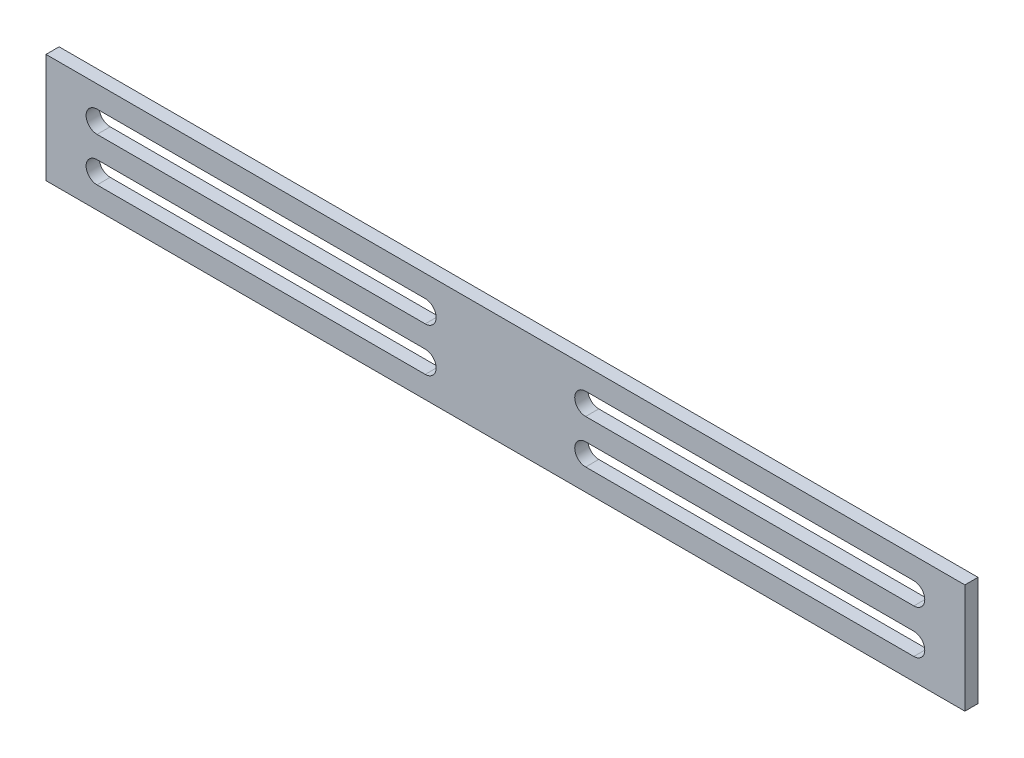
ISO-10303-21;
HEADER;
FILE_DESCRIPTION(('STEP AP214'),'2;1');
FILE_NAME('part.step','',(''),(''),'','','');
FILE_SCHEMA(('AUTOMOTIVE_DESIGN { 1 0 10303 214 1 1 1 1 }'));
ENDSEC;
DATA;
#1=APPLICATION_CONTEXT('core data for automotive mechanical design processes');
#2=APPLICATION_PROTOCOL_DEFINITION('international standard','automotive_design',2000,#1);
#3=PRODUCT_CONTEXT('',#1,'mechanical');
#4=PRODUCT('Part','Part','',(#3));
#5=PRODUCT_RELATED_PRODUCT_CATEGORY('part','',(#4));
#6=PRODUCT_DEFINITION_FORMATION('','',#4);
#7=PRODUCT_DEFINITION_CONTEXT('part definition',#1,'design');
#8=PRODUCT_DEFINITION('design','',#6,#7);
#9=PRODUCT_DEFINITION_SHAPE('','',#8);
#10=(LENGTH_UNIT() NAMED_UNIT(*) SI_UNIT(.MILLI.,.METRE.));
#11=(NAMED_UNIT(*) PLANE_ANGLE_UNIT() SI_UNIT($,.RADIAN.));
#12=(NAMED_UNIT(*) SI_UNIT($,.STERADIAN.) SOLID_ANGLE_UNIT());
#13=UNCERTAINTY_MEASURE_WITH_UNIT(LENGTH_MEASURE(1.E-05),#10,'distance_accuracy_value','');
#14=(GEOMETRIC_REPRESENTATION_CONTEXT(3) GLOBAL_UNCERTAINTY_ASSIGNED_CONTEXT((#13)) GLOBAL_UNIT_ASSIGNED_CONTEXT((#10,
#11,#12)) REPRESENTATION_CONTEXT('',''));
#15=CARTESIAN_POINT('',(0.,0.,0.));
#16=DIRECTION('',(0.,0.,1.));
#17=DIRECTION('',(1.,0.,0.));
#18=AXIS2_PLACEMENT_3D('',#15,#16,#17);
#19=CARTESIAN_POINT('',(63.,-7.5,1.8));
#20=DIRECTION('',(-1.,0.,0.));
#21=DIRECTION('',(0.,0.,1.));
#22=AXIS2_PLACEMENT_3D('',#19,#20,#21);
#23=PLANE('',#22);
#24=DIRECTION('',(0.,1.,0.));
#25=VECTOR('',#24,1.);
#26=CARTESIAN_POINT('',(63.,-7.5,0.));
#27=LINE('',#26,#25);
#28=CARTESIAN_POINT('',(63.,-7.5,0.));
#29=VERTEX_POINT('',#28);
#30=CARTESIAN_POINT('',(63.,7.5,0.));
#31=VERTEX_POINT('',#30);
#32=EDGE_CURVE('E297',#29,#31,#27,.T.);
#33=ORIENTED_EDGE('',*,*,#32,.T.);
#34=DIRECTION('',(0.,0.,-1.));
#35=VECTOR('',#34,1.);
#36=CARTESIAN_POINT('',(63.,7.5,1.8));
#37=LINE('',#36,#35);
#38=CARTESIAN_POINT('',(63.,7.5,1.8));
#39=VERTEX_POINT('',#38);
#40=EDGE_CURVE('E11',#39,#31,#37,.T.);
#41=ORIENTED_EDGE('',*,*,#40,.F.);
#42=DIRECTION('',(0.,1.,0.));
#43=VECTOR('',#42,1.);
#44=CARTESIAN_POINT('',(63.,-7.5,1.8));
#45=LINE('',#44,#43);
#46=CARTESIAN_POINT('',(63.,-7.5,1.8));
#47=VERTEX_POINT('',#46);
#48=EDGE_CURVE('E307',#47,#39,#45,.T.);
#49=ORIENTED_EDGE('',*,*,#48,.F.);
#50=DIRECTION('',(0.,0.,-1.));
#51=VECTOR('',#50,1.);
#52=CARTESIAN_POINT('',(63.,-7.5,1.8));
#53=LINE('',#52,#51);
#54=EDGE_CURVE('E320',#47,#29,#53,.T.);
#55=ORIENTED_EDGE('',*,*,#54,.T.);
#56=EDGE_LOOP('',(#33,#41,#49,#55));
#57=FACE_BOUND('',#56,.T.);
#58=ADVANCED_FACE('F39',(#57),#23,.F.);
#59=CARTESIAN_POINT('',(-63.,7.5,1.8));
#60=DIRECTION('',(0.,-1.,0.));
#61=DIRECTION('',(0.,0.,-1.));
#62=AXIS2_PLACEMENT_3D('',#59,#60,#61);
#63=PLANE('',#62);
#64=DIRECTION('',(-1.,0.,0.));
#65=VECTOR('',#64,1.);
#66=CARTESIAN_POINT('',(-63.,7.5,0.));
#67=LINE('',#66,#65);
#68=CARTESIAN_POINT('',(-63.,7.5,0.));
#69=VERTEX_POINT('',#68);
#70=EDGE_CURVE('E319',#31,#69,#67,.T.);
#71=ORIENTED_EDGE('',*,*,#70,.T.);
#72=DIRECTION('',(0.,0.,-1.));
#73=VECTOR('',#72,1.);
#74=CARTESIAN_POINT('',(-63.,7.5,1.8));
#75=LINE('',#74,#73);
#76=CARTESIAN_POINT('',(-63.,7.5,1.8));
#77=VERTEX_POINT('',#76);
#78=EDGE_CURVE('E46',#77,#69,#75,.T.);
#79=ORIENTED_EDGE('',*,*,#78,.F.);
#80=DIRECTION('',(-1.,0.,0.));
#81=VECTOR('',#80,1.);
#82=CARTESIAN_POINT('',(-63.,7.5,1.8));
#83=LINE('',#82,#81);
#84=EDGE_CURVE('E309',#39,#77,#83,.T.);
#85=ORIENTED_EDGE('',*,*,#84,.F.);
#86=ORIENTED_EDGE('',*,*,#40,.T.);
#87=EDGE_LOOP('',(#71,#79,#85,#86));
#88=FACE_BOUND('',#87,.T.);
#89=ADVANCED_FACE('F349',(#88),#63,.F.);
#90=CARTESIAN_POINT('',(-63.,-7.5,1.8));
#91=DIRECTION('',(1.,0.,0.));
#92=DIRECTION('',(0.,0.,-1.));
#93=AXIS2_PLACEMENT_3D('',#90,#91,#92);
#94=PLANE('',#93);
#95=DIRECTION('',(0.,-1.,0.));
#96=VECTOR('',#95,1.);
#97=CARTESIAN_POINT('',(-63.,-7.5,0.));
#98=LINE('',#97,#96);
#99=CARTESIAN_POINT('',(-63.,-7.5,0.));
#100=VERTEX_POINT('',#99);
#101=EDGE_CURVE('E325',#69,#100,#98,.T.);
#102=ORIENTED_EDGE('',*,*,#101,.T.);
#103=DIRECTION('',(0.,0.,-1.));
#104=VECTOR('',#103,1.);
#105=CARTESIAN_POINT('',(-63.,-7.5,1.8));
#106=LINE('',#105,#104);
#107=CARTESIAN_POINT('',(-63.,-7.5,1.8));
#108=VERTEX_POINT('',#107);
#109=EDGE_CURVE('E330',#108,#100,#106,.T.);
#110=ORIENTED_EDGE('',*,*,#109,.F.);
#111=DIRECTION('',(0.,-1.,0.));
#112=VECTOR('',#111,1.);
#113=CARTESIAN_POINT('',(-63.,-7.5,1.8));
#114=LINE('',#113,#112);
#115=EDGE_CURVE('E311',#77,#108,#114,.T.);
#116=ORIENTED_EDGE('',*,*,#115,.F.);
#117=ORIENTED_EDGE('',*,*,#78,.T.);
#118=EDGE_LOOP('',(#102,#110,#116,#117));
#119=FACE_BOUND('',#118,.T.);
#120=ADVANCED_FACE('F331',(#119),#94,.F.);
#121=CARTESIAN_POINT('',(-63.,-7.5,1.8));
#122=DIRECTION('',(0.,1.,0.));
#123=DIRECTION('',(0.,0.,1.));
#124=AXIS2_PLACEMENT_3D('',#121,#122,#123);
#125=PLANE('',#124);
#126=DIRECTION('',(1.,0.,0.));
#127=VECTOR('',#126,1.);
#128=CARTESIAN_POINT('',(-63.,-7.5,0.));
#129=LINE('',#128,#127);
#130=EDGE_CURVE('E313',#100,#29,#129,.T.);
#131=ORIENTED_EDGE('',*,*,#130,.T.);
#132=ORIENTED_EDGE('',*,*,#54,.F.);
#133=DIRECTION('',(1.,0.,0.));
#134=VECTOR('',#133,1.);
#135=CARTESIAN_POINT('',(-63.,-7.5,1.8));
#136=LINE('',#135,#134);
#137=EDGE_CURVE('E312',#108,#47,#136,.T.);
#138=ORIENTED_EDGE('',*,*,#137,.F.);
#139=ORIENTED_EDGE('',*,*,#109,.T.);
#140=EDGE_LOOP('',(#131,#132,#138,#139));
#141=FACE_BOUND('',#140,.T.);
#142=ADVANCED_FACE('F343',(#141),#125,.F.);
#143=CARTESIAN_POINT('',(0.,0.,1.8));
#144=DIRECTION('',(0.,0.,-1.));
#145=DIRECTION('',(-1.,0.,0.));
#146=AXIS2_PLACEMENT_3D('',#143,#144,#145);
#147=PLANE('',#146);
#148=DIRECTION('',(-1.,0.,0.));
#149=VECTOR('',#148,1.);
#150=CARTESIAN_POINT('',(56.,4.50000000000009,1.8));
#151=LINE('',#150,#149);
#152=CARTESIAN_POINT('',(56.,4.50000000000009,1.8));
#153=VERTEX_POINT('',#152);
#154=CARTESIAN_POINT('',(11.,4.50000000000006,1.8));
#155=VERTEX_POINT('',#154);
#156=EDGE_CURVE('E263',#153,#155,#151,.T.);
#157=ORIENTED_EDGE('',*,*,#156,.F.);
#158=CARTESIAN_POINT('',(56.,3.00000000000006,1.8));
#159=DIRECTION('',(0.,0.,1.));
#160=DIRECTION('',(-1.,0.,0.));
#161=AXIS2_PLACEMENT_3D('',#158,#159,#160);
#162=CIRCLE('',#161,1.50000000000004);
#163=CARTESIAN_POINT('',(56.,1.50000000000001,1.8));
#164=VERTEX_POINT('',#163);
#165=EDGE_CURVE('E52',#164,#153,#162,.T.);
#166=ORIENTED_EDGE('',*,*,#165,.F.);
#167=DIRECTION('',(1.,0.,0.));
#168=VECTOR('',#167,1.);
#169=CARTESIAN_POINT('',(56.,1.50000000000001,1.8));
#170=LINE('',#169,#168);
#171=CARTESIAN_POINT('',(11.,1.50000000000001,1.8));
#172=VERTEX_POINT('',#171);
#173=EDGE_CURVE('E258',#172,#164,#170,.T.);
#174=ORIENTED_EDGE('',*,*,#173,.F.);
#175=CARTESIAN_POINT('',(11.,3.00000000000003,1.8));
#176=DIRECTION('',(0.,0.,1.));
#177=DIRECTION('',(-1.,0.,0.));
#178=AXIS2_PLACEMENT_3D('',#175,#176,#177);
#179=CIRCLE('',#178,1.50000000000002);
#180=EDGE_CURVE('E259',#155,#172,#179,.T.);
#181=ORIENTED_EDGE('',*,*,#180,.F.);
#182=EDGE_LOOP('',(#157,#166,#174,#181));
#183=FACE_BOUND('',#182,.T.);
#184=DIRECTION('',(-1.,0.,0.));
#185=VECTOR('',#184,1.);
#186=CARTESIAN_POINT('',(56.,-1.50000000000001,1.8));
#187=LINE('',#186,#185);
#188=CARTESIAN_POINT('',(56.,-1.50000000000001,1.8));
#189=VERTEX_POINT('',#188);
#190=CARTESIAN_POINT('',(11.,-1.50000000000002,1.8));
#191=VERTEX_POINT('',#190);
#192=EDGE_CURVE('E233',#189,#191,#187,.T.);
#193=ORIENTED_EDGE('',*,*,#192,.F.);
#194=CARTESIAN_POINT('',(56.,-3.00000000000006,1.8));
#195=DIRECTION('',(0.,0.,1.));
#196=DIRECTION('',(1.,0.,0.));
#197=AXIS2_PLACEMENT_3D('',#194,#195,#196);
#198=CIRCLE('',#197,1.50000000000004);
#199=CARTESIAN_POINT('',(56.,-4.50000000000009,1.8));
#200=VERTEX_POINT('',#199);
#201=EDGE_CURVE('E64',#200,#189,#198,.T.);
#202=ORIENTED_EDGE('',*,*,#201,.F.);
#203=DIRECTION('',(1.,0.,0.));
#204=VECTOR('',#203,1.);
#205=CARTESIAN_POINT('',(56.,-4.50000000000009,1.8));
#206=LINE('',#205,#204);
#207=CARTESIAN_POINT('',(11.,-4.50000000000008,1.8));
#208=VERTEX_POINT('',#207);
#209=EDGE_CURVE('E229',#208,#200,#206,.T.);
#210=ORIENTED_EDGE('',*,*,#209,.F.);
#211=CARTESIAN_POINT('',(11.,-3.00000000000004,1.8));
#212=DIRECTION('',(0.,0.,1.));
#213=DIRECTION('',(1.,0.,0.));
#214=AXIS2_PLACEMENT_3D('',#211,#212,#213);
#215=CIRCLE('',#214,1.50000000000002);
#216=EDGE_CURVE('E228',#191,#208,#215,.T.);
#217=ORIENTED_EDGE('',*,*,#216,.F.);
#218=EDGE_LOOP('',(#193,#202,#210,#217));
#219=FACE_BOUND('',#218,.T.);
#220=DIRECTION('',(1.,0.,0.));
#221=VECTOR('',#220,1.);
#222=CARTESIAN_POINT('',(-56.,-4.50000000000009,1.8));
#223=LINE('',#222,#221);
#224=CARTESIAN_POINT('',(-56.,-4.50000000000009,1.8));
#225=VERTEX_POINT('',#224);
#226=CARTESIAN_POINT('',(-11.,-4.50000000000008,1.8));
#227=VERTEX_POINT('',#226);
#228=EDGE_CURVE('E200',#225,#227,#223,.T.);
#229=ORIENTED_EDGE('',*,*,#228,.F.);
#230=CARTESIAN_POINT('',(-56.,-3.00000000000006,1.8));
#231=DIRECTION('',(0.,0.,1.));
#232=DIRECTION('',(-1.,0.,0.));
#233=AXIS2_PLACEMENT_3D('',#230,#231,#232);
#234=CIRCLE('',#233,1.50000000000003);
#235=CARTESIAN_POINT('',(-56.,-1.50000000000004,1.8));
#236=VERTEX_POINT('',#235);
#237=EDGE_CURVE('E178',#236,#225,#234,.T.);
#238=ORIENTED_EDGE('',*,*,#237,.F.);
#239=DIRECTION('',(-1.,0.,0.));
#240=VECTOR('',#239,1.);
#241=CARTESIAN_POINT('',(-56.,-1.50000000000004,1.8));
#242=LINE('',#241,#240);
#243=CARTESIAN_POINT('',(-11.,-1.50000000000003,1.8));
#244=VERTEX_POINT('',#243);
#245=EDGE_CURVE('E190',#244,#236,#242,.T.);
#246=ORIENTED_EDGE('',*,*,#245,.F.);
#247=CARTESIAN_POINT('',(-11.,-3.00000000000005,1.8));
#248=DIRECTION('',(0.,0.,1.));
#249=DIRECTION('',(-1.,0.,0.));
#250=AXIS2_PLACEMENT_3D('',#247,#248,#249);
#251=CIRCLE('',#250,1.50000000000002);
#252=EDGE_CURVE('E193',#227,#244,#251,.T.);
#253=ORIENTED_EDGE('',*,*,#252,.F.);
#254=EDGE_LOOP('',(#229,#238,#246,#253));
#255=FACE_BOUND('',#254,.T.);
#256=DIRECTION('',(1.,0.,0.));
#257=VECTOR('',#256,1.);
#258=CARTESIAN_POINT('',(-56.,1.50000000000001,1.8));
#259=LINE('',#258,#257);
#260=CARTESIAN_POINT('',(-56.,1.50000000000001,1.8));
#261=VERTEX_POINT('',#260);
#262=CARTESIAN_POINT('',(-11.,1.50000000000001,1.8));
#263=VERTEX_POINT('',#262);
#264=EDGE_CURVE('E205',#261,#263,#259,.T.);
#265=ORIENTED_EDGE('',*,*,#264,.F.);
#266=CARTESIAN_POINT('',(-56.,3.00000000000003,1.8));
#267=DIRECTION('',(0.,0.,1.));
#268=DIRECTION('',(1.,0.,0.));
#269=AXIS2_PLACEMENT_3D('',#266,#267,#268);
#270=CIRCLE('',#269,1.50000000000003);
#271=CARTESIAN_POINT('',(-56.,4.50000000000006,1.8));
#272=VERTEX_POINT('',#271);
#273=EDGE_CURVE('E199',#272,#261,#270,.T.);
#274=ORIENTED_EDGE('',*,*,#273,.F.);
#275=DIRECTION('',(-1.,0.,0.));
#276=VECTOR('',#275,1.);
#277=CARTESIAN_POINT('',(-56.,4.50000000000006,1.8));
#278=LINE('',#277,#276);
#279=CARTESIAN_POINT('',(-11.,4.50000000000006,1.8));
#280=VERTEX_POINT('',#279);
#281=EDGE_CURVE('E284',#280,#272,#278,.T.);
#282=ORIENTED_EDGE('',*,*,#281,.F.);
#283=CARTESIAN_POINT('',(-11.,3.00000000000003,1.8));
#284=DIRECTION('',(0.,0.,1.));
#285=DIRECTION('',(1.,0.,0.));
#286=AXIS2_PLACEMENT_3D('',#283,#284,#285);
#287=CIRCLE('',#286,1.50000000000002);
#288=EDGE_CURVE('E291',#263,#280,#287,.T.);
#289=ORIENTED_EDGE('',*,*,#288,.F.);
#290=EDGE_LOOP('',(#265,#274,#282,#289));
#291=FACE_BOUND('',#290,.T.);
#292=ORIENTED_EDGE('',*,*,#48,.T.);
#293=ORIENTED_EDGE('',*,*,#84,.T.);
#294=ORIENTED_EDGE('',*,*,#115,.T.);
#295=ORIENTED_EDGE('',*,*,#137,.T.);
#296=EDGE_LOOP('',(#292,#293,#294,#295));
#297=FACE_BOUND('',#296,.T.);
#298=ADVANCED_FACE('F198',(#183,#219,#255,#291,#297),#147,.F.);
#299=CARTESIAN_POINT('',(0.,0.,0.));
#300=DIRECTION('',(0.,0.,-1.));
#301=DIRECTION('',(-1.,0.,0.));
#302=AXIS2_PLACEMENT_3D('',#299,#300,#301);
#303=PLANE('',#302);
#304=CARTESIAN_POINT('',(56.,3.00000000000006,0.));
#305=DIRECTION('',(0.,0.,1.));
#306=DIRECTION('',(-1.,0.,0.));
#307=AXIS2_PLACEMENT_3D('',#304,#305,#306);
#308=CIRCLE('',#307,1.50000000000004);
#309=CARTESIAN_POINT('',(56.,1.50000000000001,0.));
#310=VERTEX_POINT('',#309);
#311=CARTESIAN_POINT('',(56.,4.50000000000009,0.));
#312=VERTEX_POINT('',#311);
#313=EDGE_CURVE('E257',#310,#312,#308,.T.);
#314=ORIENTED_EDGE('',*,*,#313,.T.);
#315=DIRECTION('',(-1.,0.,0.));
#316=VECTOR('',#315,1.);
#317=CARTESIAN_POINT('',(56.,4.50000000000009,0.));
#318=LINE('',#317,#316);
#319=CARTESIAN_POINT('',(11.,4.50000000000006,0.));
#320=VERTEX_POINT('',#319);
#321=EDGE_CURVE('E275',#312,#320,#318,.T.);
#322=ORIENTED_EDGE('',*,*,#321,.T.);
#323=CARTESIAN_POINT('',(11.,3.00000000000003,0.));
#324=DIRECTION('',(0.,0.,1.));
#325=DIRECTION('',(-1.,0.,0.));
#326=AXIS2_PLACEMENT_3D('',#323,#324,#325);
#327=CIRCLE('',#326,1.50000000000002);
#328=CARTESIAN_POINT('',(11.,1.50000000000001,0.));
#329=VERTEX_POINT('',#328);
#330=EDGE_CURVE('E267',#320,#329,#327,.T.);
#331=ORIENTED_EDGE('',*,*,#330,.T.);
#332=DIRECTION('',(1.,0.,0.));
#333=VECTOR('',#332,1.);
#334=CARTESIAN_POINT('',(56.,1.50000000000001,0.));
#335=LINE('',#334,#333);
#336=EDGE_CURVE('E249',#329,#310,#335,.T.);
#337=ORIENTED_EDGE('',*,*,#336,.T.);
#338=EDGE_LOOP('',(#314,#322,#331,#337));
#339=FACE_BOUND('',#338,.T.);
#340=CARTESIAN_POINT('',(56.,-3.00000000000006,0.));
#341=DIRECTION('',(0.,0.,1.));
#342=DIRECTION('',(1.,0.,0.));
#343=AXIS2_PLACEMENT_3D('',#340,#341,#342);
#344=CIRCLE('',#343,1.50000000000004);
#345=CARTESIAN_POINT('',(56.,-4.50000000000009,0.));
#346=VERTEX_POINT('',#345);
#347=CARTESIAN_POINT('',(56.,-1.50000000000001,0.));
#348=VERTEX_POINT('',#347);
#349=EDGE_CURVE('E227',#346,#348,#344,.T.);
#350=ORIENTED_EDGE('',*,*,#349,.T.);
#351=DIRECTION('',(-1.,0.,0.));
#352=VECTOR('',#351,1.);
#353=CARTESIAN_POINT('',(56.,-1.50000000000001,0.));
#354=LINE('',#353,#352);
#355=CARTESIAN_POINT('',(11.,-1.50000000000003,0.));
#356=VERTEX_POINT('',#355);
#357=EDGE_CURVE('E241',#348,#356,#354,.T.);
#358=ORIENTED_EDGE('',*,*,#357,.T.);
#359=CARTESIAN_POINT('',(11.,-3.00000000000004,0.));
#360=DIRECTION('',(0.,0.,1.));
#361=DIRECTION('',(1.,0.,0.));
#362=AXIS2_PLACEMENT_3D('',#359,#360,#361);
#363=CIRCLE('',#362,1.50000000000002);
#364=CARTESIAN_POINT('',(11.,-4.50000000000008,0.));
#365=VERTEX_POINT('',#364);
#366=EDGE_CURVE('E239',#356,#365,#363,.T.);
#367=ORIENTED_EDGE('',*,*,#366,.T.);
#368=DIRECTION('',(1.,0.,0.));
#369=VECTOR('',#368,1.);
#370=CARTESIAN_POINT('',(56.,-4.50000000000009,0.));
#371=LINE('',#370,#369);
#372=EDGE_CURVE('E218',#365,#346,#371,.T.);
#373=ORIENTED_EDGE('',*,*,#372,.T.);
#374=EDGE_LOOP('',(#350,#358,#367,#373));
#375=FACE_BOUND('',#374,.T.);
#376=CARTESIAN_POINT('',(-56.,-3.00000000000006,0.));
#377=DIRECTION('',(0.,0.,1.));
#378=DIRECTION('',(-1.,0.,0.));
#379=AXIS2_PLACEMENT_3D('',#376,#377,#378);
#380=CIRCLE('',#379,1.50000000000003);
#381=CARTESIAN_POINT('',(-56.,-1.50000000000004,0.));
#382=VERTEX_POINT('',#381);
#383=CARTESIAN_POINT('',(-56.,-4.50000000000009,0.));
#384=VERTEX_POINT('',#383);
#385=EDGE_CURVE('E182',#382,#384,#380,.T.);
#386=ORIENTED_EDGE('',*,*,#385,.T.);
#387=DIRECTION('',(1.,0.,0.));
#388=VECTOR('',#387,1.);
#389=CARTESIAN_POINT('',(-56.,-4.50000000000009,0.));
#390=LINE('',#389,#388);
#391=CARTESIAN_POINT('',(-11.,-4.50000000000008,0.));
#392=VERTEX_POINT('',#391);
#393=EDGE_CURVE('E213',#384,#392,#390,.T.);
#394=ORIENTED_EDGE('',*,*,#393,.T.);
#395=CARTESIAN_POINT('',(-11.,-3.00000000000005,0.));
#396=DIRECTION('',(0.,0.,1.));
#397=DIRECTION('',(-1.,0.,0.));
#398=AXIS2_PLACEMENT_3D('',#395,#396,#397);
#399=CIRCLE('',#398,1.50000000000002);
#400=CARTESIAN_POINT('',(-11.,-1.50000000000003,0.));
#401=VERTEX_POINT('',#400);
#402=EDGE_CURVE('E207',#392,#401,#399,.T.);
#403=ORIENTED_EDGE('',*,*,#402,.T.);
#404=DIRECTION('',(-1.,0.,0.));
#405=VECTOR('',#404,1.);
#406=CARTESIAN_POINT('',(-56.,-1.50000000000004,0.));
#407=LINE('',#406,#405);
#408=EDGE_CURVE('E210',#401,#382,#407,.T.);
#409=ORIENTED_EDGE('',*,*,#408,.T.);
#410=EDGE_LOOP('',(#386,#394,#403,#409));
#411=FACE_BOUND('',#410,.T.);
#412=CARTESIAN_POINT('',(-56.,3.00000000000003,0.));
#413=DIRECTION('',(0.,0.,1.));
#414=DIRECTION('',(1.,0.,0.));
#415=AXIS2_PLACEMENT_3D('',#412,#413,#414);
#416=CIRCLE('',#415,1.50000000000003);
#417=CARTESIAN_POINT('',(-56.,4.50000000000006,0.));
#418=VERTEX_POINT('',#417);
#419=CARTESIAN_POINT('',(-56.,1.50000000000001,0.));
#420=VERTEX_POINT('',#419);
#421=EDGE_CURVE('E280',#418,#420,#416,.T.);
#422=ORIENTED_EDGE('',*,*,#421,.T.);
#423=DIRECTION('',(1.,0.,0.));
#424=VECTOR('',#423,1.);
#425=CARTESIAN_POINT('',(-56.,1.50000000000001,0.));
#426=LINE('',#425,#424);
#427=CARTESIAN_POINT('',(-11.,1.50000000000002,0.));
#428=VERTEX_POINT('',#427);
#429=EDGE_CURVE('E278',#420,#428,#426,.T.);
#430=ORIENTED_EDGE('',*,*,#429,.T.);
#431=CARTESIAN_POINT('',(-11.,3.00000000000003,0.));
#432=DIRECTION('',(0.,0.,1.));
#433=DIRECTION('',(1.,0.,0.));
#434=AXIS2_PLACEMENT_3D('',#431,#432,#433);
#435=CIRCLE('',#434,1.50000000000002);
#436=CARTESIAN_POINT('',(-11.,4.50000000000006,0.));
#437=VERTEX_POINT('',#436);
#438=EDGE_CURVE('E283',#428,#437,#435,.T.);
#439=ORIENTED_EDGE('',*,*,#438,.T.);
#440=DIRECTION('',(-1.,0.,0.));
#441=VECTOR('',#440,1.);
#442=CARTESIAN_POINT('',(-56.,4.50000000000006,0.));
#443=LINE('',#442,#441);
#444=EDGE_CURVE('E290',#437,#418,#443,.T.);
#445=ORIENTED_EDGE('',*,*,#444,.T.);
#446=EDGE_LOOP('',(#422,#430,#439,#445));
#447=FACE_BOUND('',#446,.T.);
#448=ORIENTED_EDGE('',*,*,#32,.F.);
#449=ORIENTED_EDGE('',*,*,#130,.F.);
#450=ORIENTED_EDGE('',*,*,#101,.F.);
#451=ORIENTED_EDGE('',*,*,#70,.F.);
#452=EDGE_LOOP('',(#448,#449,#450,#451));
#453=FACE_BOUND('',#452,.T.);
#454=ADVANCED_FACE('F337',(#339,#375,#411,#447,#453),#303,.T.);
#455=CARTESIAN_POINT('',(-56.,3.00000000000003,0.));
#456=DIRECTION('',(0.,0.,1.));
#457=DIRECTION('',(1.,0.,0.));
#458=AXIS2_PLACEMENT_3D('',#455,#456,#457);
#459=CYLINDRICAL_SURFACE('',#458,1.50000000000003);
#460=ORIENTED_EDGE('',*,*,#273,.T.);
#461=DIRECTION('',(0.,0.,1.));
#462=VECTOR('',#461,1.);
#463=CARTESIAN_POINT('',(-56.,1.50000000000001,0.));
#464=LINE('',#463,#462);
#465=EDGE_CURVE('E289',#420,#261,#464,.T.);
#466=ORIENTED_EDGE('',*,*,#465,.F.);
#467=ORIENTED_EDGE('',*,*,#421,.F.);
#468=DIRECTION('',(0.,0.,1.));
#469=VECTOR('',#468,1.);
#470=CARTESIAN_POINT('',(-56.,4.50000000000006,0.));
#471=LINE('',#470,#469);
#472=EDGE_CURVE('E300',#418,#272,#471,.T.);
#473=ORIENTED_EDGE('',*,*,#472,.T.);
#474=EDGE_LOOP('',(#460,#466,#467,#473));
#475=FACE_BOUND('',#474,.T.);
#476=ADVANCED_FACE('F363',(#475),#459,.F.);
#477=CARTESIAN_POINT('',(-56.,4.50000000000006,0.));
#478=DIRECTION('',(0.,1.,0.));
#479=DIRECTION('',(0.,0.,1.));
#480=AXIS2_PLACEMENT_3D('',#477,#478,#479);
#481=PLANE('',#480);
#482=ORIENTED_EDGE('',*,*,#281,.T.);
#483=ORIENTED_EDGE('',*,*,#472,.F.);
#484=ORIENTED_EDGE('',*,*,#444,.F.);
#485=DIRECTION('',(0.,0.,1.));
#486=VECTOR('',#485,1.);
#487=CARTESIAN_POINT('',(-11.,4.50000000000006,0.));
#488=LINE('',#487,#486);
#489=EDGE_CURVE('E302',#437,#280,#488,.T.);
#490=ORIENTED_EDGE('',*,*,#489,.T.);
#491=EDGE_LOOP('',(#482,#483,#484,#490));
#492=FACE_BOUND('',#491,.T.);
#493=ADVANCED_FACE('F366',(#492),#481,.F.);
#494=CARTESIAN_POINT('',(-11.,3.00000000000003,0.));
#495=DIRECTION('',(0.,0.,1.));
#496=DIRECTION('',(1.,0.,0.));
#497=AXIS2_PLACEMENT_3D('',#494,#495,#496);
#498=CYLINDRICAL_SURFACE('',#497,1.50000000000002);
#499=ORIENTED_EDGE('',*,*,#288,.T.);
#500=ORIENTED_EDGE('',*,*,#489,.F.);
#501=ORIENTED_EDGE('',*,*,#438,.F.);
#502=DIRECTION('',(0.,0.,1.));
#503=VECTOR('',#502,1.);
#504=CARTESIAN_POINT('',(-11.,1.50000000000001,0.));
#505=LINE('',#504,#503);
#506=EDGE_CURVE('E303',#428,#263,#505,.T.);
#507=ORIENTED_EDGE('',*,*,#506,.T.);
#508=EDGE_LOOP('',(#499,#500,#501,#507));
#509=FACE_BOUND('',#508,.T.);
#510=ADVANCED_FACE('F373',(#509),#498,.F.);
#511=CARTESIAN_POINT('',(-56.,1.50000000000001,0.));
#512=DIRECTION('',(0.,-1.,0.));
#513=DIRECTION('',(1.,0.,0.));
#514=AXIS2_PLACEMENT_3D('',#511,#512,#513);
#515=PLANE('',#514);
#516=ORIENTED_EDGE('',*,*,#264,.T.);
#517=ORIENTED_EDGE('',*,*,#506,.F.);
#518=ORIENTED_EDGE('',*,*,#429,.F.);
#519=ORIENTED_EDGE('',*,*,#465,.T.);
#520=EDGE_LOOP('',(#516,#517,#518,#519));
#521=FACE_BOUND('',#520,.T.);
#522=ADVANCED_FACE('F367',(#521),#515,.F.);
#523=CARTESIAN_POINT('',(-56.,-3.00000000000006,0.));
#524=DIRECTION('',(0.,0.,1.));
#525=DIRECTION('',(1.,0.,0.));
#526=AXIS2_PLACEMENT_3D('',#523,#524,#525);
#527=CYLINDRICAL_SURFACE('',#526,1.50000000000003);
#528=ORIENTED_EDGE('',*,*,#237,.T.);
#529=DIRECTION('',(0.,0.,1.));
#530=VECTOR('',#529,1.);
#531=CARTESIAN_POINT('',(-56.,-4.50000000000009,0.));
#532=LINE('',#531,#530);
#533=EDGE_CURVE('E209',#384,#225,#532,.T.);
#534=ORIENTED_EDGE('',*,*,#533,.F.);
#535=ORIENTED_EDGE('',*,*,#385,.F.);
#536=DIRECTION('',(0.,0.,1.));
#537=VECTOR('',#536,1.);
#538=CARTESIAN_POINT('',(-56.,-1.50000000000004,0.));
#539=LINE('',#538,#537);
#540=EDGE_CURVE('E173',#382,#236,#539,.T.);
#541=ORIENTED_EDGE('',*,*,#540,.T.);
#542=EDGE_LOOP('',(#528,#534,#535,#541));
#543=FACE_BOUND('',#542,.T.);
#544=ADVANCED_FACE('F177',(#543),#527,.F.);
#545=CARTESIAN_POINT('',(-56.,-1.50000000000004,0.));
#546=DIRECTION('',(0.,1.,0.));
#547=DIRECTION('',(0.,0.,1.));
#548=AXIS2_PLACEMENT_3D('',#545,#546,#547);
#549=PLANE('',#548);
#550=ORIENTED_EDGE('',*,*,#245,.T.);
#551=ORIENTED_EDGE('',*,*,#540,.F.);
#552=ORIENTED_EDGE('',*,*,#408,.F.);
#553=DIRECTION('',(0.,0.,1.));
#554=VECTOR('',#553,1.);
#555=CARTESIAN_POINT('',(-11.,-1.50000000000003,0.));
#556=LINE('',#555,#554);
#557=EDGE_CURVE('E183',#401,#244,#556,.T.);
#558=ORIENTED_EDGE('',*,*,#557,.T.);
#559=EDGE_LOOP('',(#550,#551,#552,#558));
#560=FACE_BOUND('',#559,.T.);
#561=ADVANCED_FACE('F188',(#560),#549,.F.);
#562=CARTESIAN_POINT('',(-11.,-3.00000000000005,0.));
#563=DIRECTION('',(0.,0.,1.));
#564=DIRECTION('',(1.,0.,0.));
#565=AXIS2_PLACEMENT_3D('',#562,#563,#564);
#566=CYLINDRICAL_SURFACE('',#565,1.50000000000002);
#567=ORIENTED_EDGE('',*,*,#252,.T.);
#568=ORIENTED_EDGE('',*,*,#557,.F.);
#569=ORIENTED_EDGE('',*,*,#402,.F.);
#570=DIRECTION('',(0.,0.,1.));
#571=VECTOR('',#570,1.);
#572=CARTESIAN_POINT('',(-11.,-4.50000000000008,0.));
#573=LINE('',#572,#571);
#574=EDGE_CURVE('E551',#392,#227,#573,.T.);
#575=ORIENTED_EDGE('',*,*,#574,.T.);
#576=EDGE_LOOP('',(#567,#568,#569,#575));
#577=FACE_BOUND('',#576,.T.);
#578=ADVANCED_FACE('F414',(#577),#566,.F.);
#579=CARTESIAN_POINT('',(-56.,-4.50000000000009,0.));
#580=DIRECTION('',(0.,-1.,0.));
#581=DIRECTION('',(1.,0.,0.));
#582=AXIS2_PLACEMENT_3D('',#579,#580,#581);
#583=PLANE('',#582);
#584=ORIENTED_EDGE('',*,*,#228,.T.);
#585=ORIENTED_EDGE('',*,*,#574,.F.);
#586=ORIENTED_EDGE('',*,*,#393,.F.);
#587=ORIENTED_EDGE('',*,*,#533,.T.);
#588=EDGE_LOOP('',(#584,#585,#586,#587));
#589=FACE_BOUND('',#588,.T.);
#590=ADVANCED_FACE('F412',(#589),#583,.F.);
#591=CARTESIAN_POINT('',(56.,-3.00000000000006,0.));
#592=DIRECTION('',(0.,0.,1.));
#593=DIRECTION('',(1.,0.,0.));
#594=AXIS2_PLACEMENT_3D('',#591,#592,#593);
#595=CYLINDRICAL_SURFACE('',#594,1.50000000000004);
#596=ORIENTED_EDGE('',*,*,#201,.T.);
#597=DIRECTION('',(0.,0.,1.));
#598=VECTOR('',#597,1.);
#599=CARTESIAN_POINT('',(56.,-1.50000000000001,0.));
#600=LINE('',#599,#598);
#601=EDGE_CURVE('E220',#348,#189,#600,.T.);
#602=ORIENTED_EDGE('',*,*,#601,.F.);
#603=ORIENTED_EDGE('',*,*,#349,.F.);
#604=DIRECTION('',(0.,0.,1.));
#605=VECTOR('',#604,1.);
#606=CARTESIAN_POINT('',(56.,-4.50000000000009,0.));
#607=LINE('',#606,#605);
#608=EDGE_CURVE('E221',#346,#200,#607,.T.);
#609=ORIENTED_EDGE('',*,*,#608,.T.);
#610=EDGE_LOOP('',(#596,#602,#603,#609));
#611=FACE_BOUND('',#610,.T.);
#612=ADVANCED_FACE('F402',(#611),#595,.F.);
#613=CARTESIAN_POINT('',(56.,-4.50000000000009,0.));
#614=DIRECTION('',(0.,-1.,0.));
#615=DIRECTION('',(1.,0.,0.));
#616=AXIS2_PLACEMENT_3D('',#613,#614,#615);
#617=PLANE('',#616);
#618=ORIENTED_EDGE('',*,*,#209,.T.);
#619=ORIENTED_EDGE('',*,*,#608,.F.);
#620=ORIENTED_EDGE('',*,*,#372,.F.);
#621=DIRECTION('',(0.,0.,1.));
#622=VECTOR('',#621,1.);
#623=CARTESIAN_POINT('',(11.,-4.50000000000008,0.));
#624=LINE('',#623,#622);
#625=EDGE_CURVE('E225',#365,#208,#624,.T.);
#626=ORIENTED_EDGE('',*,*,#625,.T.);
#627=EDGE_LOOP('',(#618,#619,#620,#626));
#628=FACE_BOUND('',#627,.T.);
#629=ADVANCED_FACE('F400',(#628),#617,.F.);
#630=CARTESIAN_POINT('',(11.,-3.00000000000004,0.));
#631=DIRECTION('',(0.,0.,1.));
#632=DIRECTION('',(1.,0.,0.));
#633=AXIS2_PLACEMENT_3D('',#630,#631,#632);
#634=CYLINDRICAL_SURFACE('',#633,1.50000000000002);
#635=ORIENTED_EDGE('',*,*,#216,.T.);
#636=ORIENTED_EDGE('',*,*,#625,.F.);
#637=ORIENTED_EDGE('',*,*,#366,.F.);
#638=DIRECTION('',(0.,0.,1.));
#639=VECTOR('',#638,1.);
#640=CARTESIAN_POINT('',(11.,-1.50000000000002,0.));
#641=LINE('',#640,#639);
#642=EDGE_CURVE('E219',#356,#191,#641,.T.);
#643=ORIENTED_EDGE('',*,*,#642,.T.);
#644=EDGE_LOOP('',(#635,#636,#637,#643));
#645=FACE_BOUND('',#644,.T.);
#646=ADVANCED_FACE('F396',(#645),#634,.F.);
#647=CARTESIAN_POINT('',(56.,-1.50000000000001,0.));
#648=DIRECTION('',(0.,1.,0.));
#649=DIRECTION('',(-1.,0.,0.));
#650=AXIS2_PLACEMENT_3D('',#647,#648,#649);
#651=PLANE('',#650);
#652=ORIENTED_EDGE('',*,*,#192,.T.);
#653=ORIENTED_EDGE('',*,*,#642,.F.);
#654=ORIENTED_EDGE('',*,*,#357,.F.);
#655=ORIENTED_EDGE('',*,*,#601,.T.);
#656=EDGE_LOOP('',(#652,#653,#654,#655));
#657=FACE_BOUND('',#656,.T.);
#658=ADVANCED_FACE('F397',(#657),#651,.F.);
#659=CARTESIAN_POINT('',(56.,3.00000000000006,0.));
#660=DIRECTION('',(0.,0.,1.));
#661=DIRECTION('',(1.,0.,0.));
#662=AXIS2_PLACEMENT_3D('',#659,#660,#661);
#663=CYLINDRICAL_SURFACE('',#662,1.50000000000004);
#664=ORIENTED_EDGE('',*,*,#165,.T.);
#665=DIRECTION('',(0.,0.,1.));
#666=VECTOR('',#665,1.);
#667=CARTESIAN_POINT('',(56.,4.50000000000009,0.));
#668=LINE('',#667,#666);
#669=EDGE_CURVE('E250',#312,#153,#668,.T.);
#670=ORIENTED_EDGE('',*,*,#669,.F.);
#671=ORIENTED_EDGE('',*,*,#313,.F.);
#672=DIRECTION('',(0.,0.,1.));
#673=VECTOR('',#672,1.);
#674=CARTESIAN_POINT('',(56.,1.50000000000001,0.));
#675=LINE('',#674,#673);
#676=EDGE_CURVE('E255',#310,#164,#675,.T.);
#677=ORIENTED_EDGE('',*,*,#676,.T.);
#678=EDGE_LOOP('',(#664,#670,#671,#677));
#679=FACE_BOUND('',#678,.T.);
#680=ADVANCED_FACE('F384',(#679),#663,.F.);
#681=CARTESIAN_POINT('',(56.,1.50000000000001,0.));
#682=DIRECTION('',(0.,-1.,0.));
#683=DIRECTION('',(1.,0.,0.));
#684=AXIS2_PLACEMENT_3D('',#681,#682,#683);
#685=PLANE('',#684);
#686=ORIENTED_EDGE('',*,*,#173,.T.);
#687=ORIENTED_EDGE('',*,*,#676,.F.);
#688=ORIENTED_EDGE('',*,*,#336,.F.);
#689=DIRECTION('',(0.,0.,1.));
#690=VECTOR('',#689,1.);
#691=CARTESIAN_POINT('',(11.,1.50000000000001,0.));
#692=LINE('',#691,#690);
#693=EDGE_CURVE('E252',#329,#172,#692,.T.);
#694=ORIENTED_EDGE('',*,*,#693,.T.);
#695=EDGE_LOOP('',(#686,#687,#688,#694));
#696=FACE_BOUND('',#695,.T.);
#697=ADVANCED_FACE('F381',(#696),#685,.F.);
#698=CARTESIAN_POINT('',(11.,3.00000000000003,0.));
#699=DIRECTION('',(0.,0.,1.));
#700=DIRECTION('',(1.,0.,0.));
#701=AXIS2_PLACEMENT_3D('',#698,#699,#700);
#702=CYLINDRICAL_SURFACE('',#701,1.50000000000002);
#703=ORIENTED_EDGE('',*,*,#180,.T.);
#704=ORIENTED_EDGE('',*,*,#693,.F.);
#705=ORIENTED_EDGE('',*,*,#330,.F.);
#706=DIRECTION('',(0.,0.,1.));
#707=VECTOR('',#706,1.);
#708=CARTESIAN_POINT('',(11.,4.50000000000006,0.));
#709=LINE('',#708,#707);
#710=EDGE_CURVE('E246',#320,#155,#709,.T.);
#711=ORIENTED_EDGE('',*,*,#710,.T.);
#712=EDGE_LOOP('',(#703,#704,#705,#711));
#713=FACE_BOUND('',#712,.T.);
#714=ADVANCED_FACE('F383',(#713),#702,.F.);
#715=CARTESIAN_POINT('',(56.,4.50000000000009,0.));
#716=DIRECTION('',(0.,1.,0.));
#717=DIRECTION('',(-1.,0.,0.));
#718=AXIS2_PLACEMENT_3D('',#715,#716,#717);
#719=PLANE('',#718);
#720=ORIENTED_EDGE('',*,*,#156,.T.);
#721=ORIENTED_EDGE('',*,*,#710,.F.);
#722=ORIENTED_EDGE('',*,*,#321,.F.);
#723=ORIENTED_EDGE('',*,*,#669,.T.);
#724=EDGE_LOOP('',(#720,#721,#722,#723));
#725=FACE_BOUND('',#724,.T.);
#726=ADVANCED_FACE('F386',(#725),#719,.F.);
#727=CLOSED_SHELL('',(#58,#89,#120,#142,#298,#454,#476,#493,#510,#522,#544,#561,#578,#590,#612,
#629,#646,#658,#680,#697,#714,#726));
#728=MANIFOLD_SOLID_BREP('B2',#727);
#729=ADVANCED_BREP_SHAPE_REPRESENTATION('',(#18,#728),#14);
#730=SHAPE_DEFINITION_REPRESENTATION(#9,#729);
ENDSEC;
END-ISO-10303-21;
